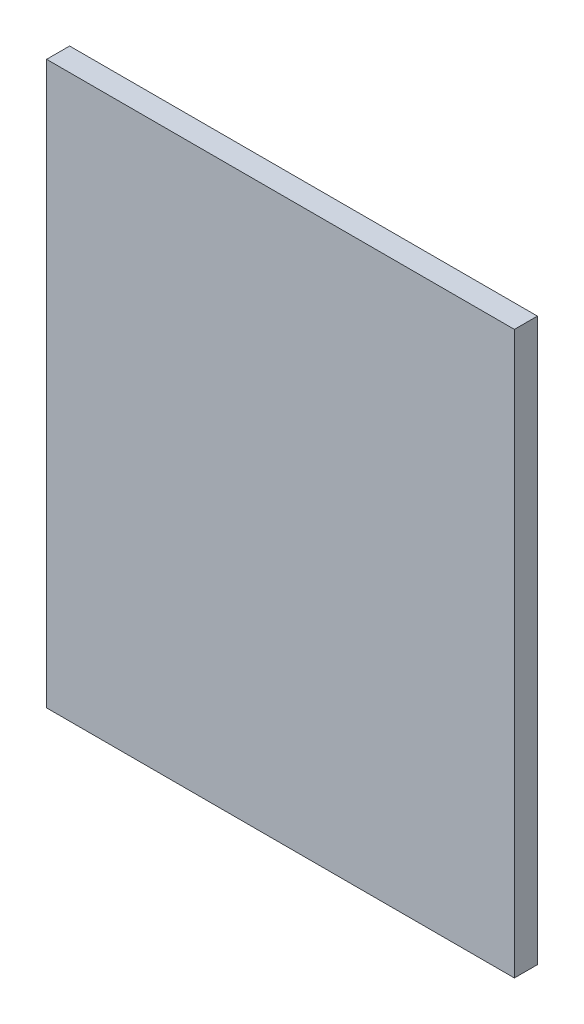
ISO-10303-21;
HEADER;
FILE_DESCRIPTION(('STEP AP214'),'2;1');
FILE_NAME('part.step','',(''),(''),'','','');
FILE_SCHEMA(('AUTOMOTIVE_DESIGN { 1 0 10303 214 1 1 1 1 }'));
ENDSEC;
DATA;
#1=APPLICATION_CONTEXT('core data for automotive mechanical design processes');
#2=APPLICATION_PROTOCOL_DEFINITION('international standard','automotive_design',2000,#1);
#3=PRODUCT_CONTEXT('',#1,'mechanical');
#4=PRODUCT('Part','Part','',(#3));
#5=PRODUCT_RELATED_PRODUCT_CATEGORY('part','',(#4));
#6=PRODUCT_DEFINITION_FORMATION('','',#4);
#7=PRODUCT_DEFINITION_CONTEXT('part definition',#1,'design');
#8=PRODUCT_DEFINITION('design','',#6,#7);
#9=PRODUCT_DEFINITION_SHAPE('','',#8);
#10=(LENGTH_UNIT() NAMED_UNIT(*) SI_UNIT(.MILLI.,.METRE.));
#11=(NAMED_UNIT(*) PLANE_ANGLE_UNIT() SI_UNIT($,.RADIAN.));
#12=(NAMED_UNIT(*) SI_UNIT($,.STERADIAN.) SOLID_ANGLE_UNIT());
#13=UNCERTAINTY_MEASURE_WITH_UNIT(LENGTH_MEASURE(1.E-05),#10,'distance_accuracy_value','');
#14=(GEOMETRIC_REPRESENTATION_CONTEXT(3) GLOBAL_UNCERTAINTY_ASSIGNED_CONTEXT((#13)) GLOBAL_UNIT_ASSIGNED_CONTEXT((#10,
#11,#12)) REPRESENTATION_CONTEXT('',''));
#15=CARTESIAN_POINT('',(0.,0.,0.));
#16=DIRECTION('',(0.,0.,1.));
#17=DIRECTION('',(1.,0.,0.));
#18=AXIS2_PLACEMENT_3D('',#15,#16,#17);
#19=CARTESIAN_POINT('',(0.,0.,5.));
#20=DIRECTION('',(1.,0.,0.));
#21=DIRECTION('',(0.,0.,-1.));
#22=AXIS2_PLACEMENT_3D('',#19,#20,#21);
#23=PLANE('',#22);
#24=DIRECTION('',(0.,-1.,0.));
#25=VECTOR('',#24,1.);
#26=CARTESIAN_POINT('',(0.,0.,0.));
#27=LINE('',#26,#25);
#28=CARTESIAN_POINT('',(0.,122.,0.));
#29=VERTEX_POINT('',#28);
#30=CARTESIAN_POINT('',(0.,0.,0.));
#31=VERTEX_POINT('',#30);
#32=EDGE_CURVE('E96',#29,#31,#27,.T.);
#33=ORIENTED_EDGE('',*,*,#32,.T.);
#34=DIRECTION('',(0.,0.,-1.));
#35=VECTOR('',#34,1.);
#36=CARTESIAN_POINT('',(0.,0.,5.));
#37=LINE('',#36,#35);
#38=CARTESIAN_POINT('',(0.,0.,5.));
#39=VERTEX_POINT('',#38);
#40=EDGE_CURVE('E11',#39,#31,#37,.T.);
#41=ORIENTED_EDGE('',*,*,#40,.F.);
#42=DIRECTION('',(0.,-1.,0.));
#43=VECTOR('',#42,1.);
#44=CARTESIAN_POINT('',(0.,0.,5.));
#45=LINE('',#44,#43);
#46=CARTESIAN_POINT('',(0.,122.,5.));
#47=VERTEX_POINT('',#46);
#48=EDGE_CURVE('E84',#47,#39,#45,.T.);
#49=ORIENTED_EDGE('',*,*,#48,.F.);
#50=DIRECTION('',(0.,0.,-1.));
#51=VECTOR('',#50,1.);
#52=CARTESIAN_POINT('',(0.,122.,5.));
#53=LINE('',#52,#51);
#54=EDGE_CURVE('E92',#47,#29,#53,.T.);
#55=ORIENTED_EDGE('',*,*,#54,.T.);
#56=EDGE_LOOP('',(#33,#41,#49,#55));
#57=FACE_BOUND('',#56,.T.);
#58=ADVANCED_FACE('F33',(#57),#23,.F.);
#59=CARTESIAN_POINT('',(0.,0.,5.));
#60=DIRECTION('',(0.,1.,0.));
#61=DIRECTION('',(0.,0.,1.));
#62=AXIS2_PLACEMENT_3D('',#59,#60,#61);
#63=PLANE('',#62);
#64=DIRECTION('',(1.,0.,0.));
#65=VECTOR('',#64,1.);
#66=CARTESIAN_POINT('',(0.,0.,0.));
#67=LINE('',#66,#65);
#68=CARTESIAN_POINT('',(101.6,0.,0.));
#69=VERTEX_POINT('',#68);
#70=EDGE_CURVE('E88',#31,#69,#67,.T.);
#71=ORIENTED_EDGE('',*,*,#70,.T.);
#72=DIRECTION('',(0.,0.,-1.));
#73=VECTOR('',#72,1.);
#74=CARTESIAN_POINT('',(101.6,0.,5.));
#75=LINE('',#74,#73);
#76=CARTESIAN_POINT('',(101.6,0.,5.));
#77=VERTEX_POINT('',#76);
#78=EDGE_CURVE('E41',#77,#69,#75,.T.);
#79=ORIENTED_EDGE('',*,*,#78,.F.);
#80=DIRECTION('',(1.,0.,0.));
#81=VECTOR('',#80,1.);
#82=CARTESIAN_POINT('',(0.,0.,5.));
#83=LINE('',#82,#81);
#84=EDGE_CURVE('E79',#39,#77,#83,.T.);
#85=ORIENTED_EDGE('',*,*,#84,.F.);
#86=ORIENTED_EDGE('',*,*,#40,.T.);
#87=EDGE_LOOP('',(#71,#79,#85,#86));
#88=FACE_BOUND('',#87,.T.);
#89=ADVANCED_FACE('F87',(#88),#63,.F.);
#90=CARTESIAN_POINT('',(101.6,0.,5.));
#91=DIRECTION('',(-1.,0.,0.));
#92=DIRECTION('',(0.,0.,1.));
#93=AXIS2_PLACEMENT_3D('',#90,#91,#92);
#94=PLANE('',#93);
#95=DIRECTION('',(0.,1.,0.));
#96=VECTOR('',#95,1.);
#97=CARTESIAN_POINT('',(101.6,0.,0.));
#98=LINE('',#97,#96);
#99=CARTESIAN_POINT('',(101.6,122.,0.));
#100=VERTEX_POINT('',#99);
#101=EDGE_CURVE('E66',#69,#100,#98,.T.);
#102=ORIENTED_EDGE('',*,*,#101,.T.);
#103=DIRECTION('',(0.,0.,-1.));
#104=VECTOR('',#103,1.);
#105=CARTESIAN_POINT('',(101.6,122.,5.));
#106=LINE('',#105,#104);
#107=CARTESIAN_POINT('',(101.6,122.,5.));
#108=VERTEX_POINT('',#107);
#109=EDGE_CURVE('E89',#108,#100,#106,.T.);
#110=ORIENTED_EDGE('',*,*,#109,.F.);
#111=DIRECTION('',(0.,1.,0.));
#112=VECTOR('',#111,1.);
#113=CARTESIAN_POINT('',(101.6,0.,5.));
#114=LINE('',#113,#112);
#115=EDGE_CURVE('E82',#77,#108,#114,.T.);
#116=ORIENTED_EDGE('',*,*,#115,.F.);
#117=ORIENTED_EDGE('',*,*,#78,.T.);
#118=EDGE_LOOP('',(#102,#110,#116,#117));
#119=FACE_BOUND('',#118,.T.);
#120=ADVANCED_FACE('F90',(#119),#94,.F.);
#121=CARTESIAN_POINT('',(0.,122.,5.));
#122=DIRECTION('',(0.,-1.,0.));
#123=DIRECTION('',(0.,0.,-1.));
#124=AXIS2_PLACEMENT_3D('',#121,#122,#123);
#125=PLANE('',#124);
#126=DIRECTION('',(-1.,0.,0.));
#127=VECTOR('',#126,1.);
#128=CARTESIAN_POINT('',(0.,122.,0.));
#129=LINE('',#128,#127);
#130=EDGE_CURVE('E72',#100,#29,#129,.T.);
#131=ORIENTED_EDGE('',*,*,#130,.T.);
#132=ORIENTED_EDGE('',*,*,#54,.F.);
#133=DIRECTION('',(-1.,0.,0.));
#134=VECTOR('',#133,1.);
#135=CARTESIAN_POINT('',(0.,122.,5.));
#136=LINE('',#135,#134);
#137=EDGE_CURVE('E49',#108,#47,#136,.T.);
#138=ORIENTED_EDGE('',*,*,#137,.F.);
#139=ORIENTED_EDGE('',*,*,#109,.T.);
#140=EDGE_LOOP('',(#131,#132,#138,#139));
#141=FACE_BOUND('',#140,.T.);
#142=ADVANCED_FACE('F103',(#141),#125,.F.);
#143=CARTESIAN_POINT('',(0.,0.,5.));
#144=DIRECTION('',(0.,0.,-1.));
#145=DIRECTION('',(-1.,0.,0.));
#146=AXIS2_PLACEMENT_3D('',#143,#144,#145);
#147=PLANE('',#146);
#148=ORIENTED_EDGE('',*,*,#48,.T.);
#149=ORIENTED_EDGE('',*,*,#84,.T.);
#150=ORIENTED_EDGE('',*,*,#115,.T.);
#151=ORIENTED_EDGE('',*,*,#137,.T.);
#152=EDGE_LOOP('',(#148,#149,#150,#151));
#153=FACE_BOUND('',#152,.T.);
#154=ADVANCED_FACE('F80',(#153),#147,.F.);
#155=CARTESIAN_POINT('',(0.,0.,0.));
#156=DIRECTION('',(0.,0.,-1.));
#157=DIRECTION('',(-1.,0.,0.));
#158=AXIS2_PLACEMENT_3D('',#155,#156,#157);
#159=PLANE('',#158);
#160=ORIENTED_EDGE('',*,*,#32,.F.);
#161=ORIENTED_EDGE('',*,*,#130,.F.);
#162=ORIENTED_EDGE('',*,*,#101,.F.);
#163=ORIENTED_EDGE('',*,*,#70,.F.);
#164=EDGE_LOOP('',(#160,#161,#162,#163));
#165=FACE_BOUND('',#164,.T.);
#166=ADVANCED_FACE('F106',(#165),#159,.T.);
#167=CLOSED_SHELL('',(#58,#89,#120,#142,#154,#166));
#168=MANIFOLD_SOLID_BREP('B2',#167);
#169=ADVANCED_BREP_SHAPE_REPRESENTATION('',(#18,#168),#14);
#170=SHAPE_DEFINITION_REPRESENTATION(#9,#169);
ENDSEC;
END-ISO-10303-21;
